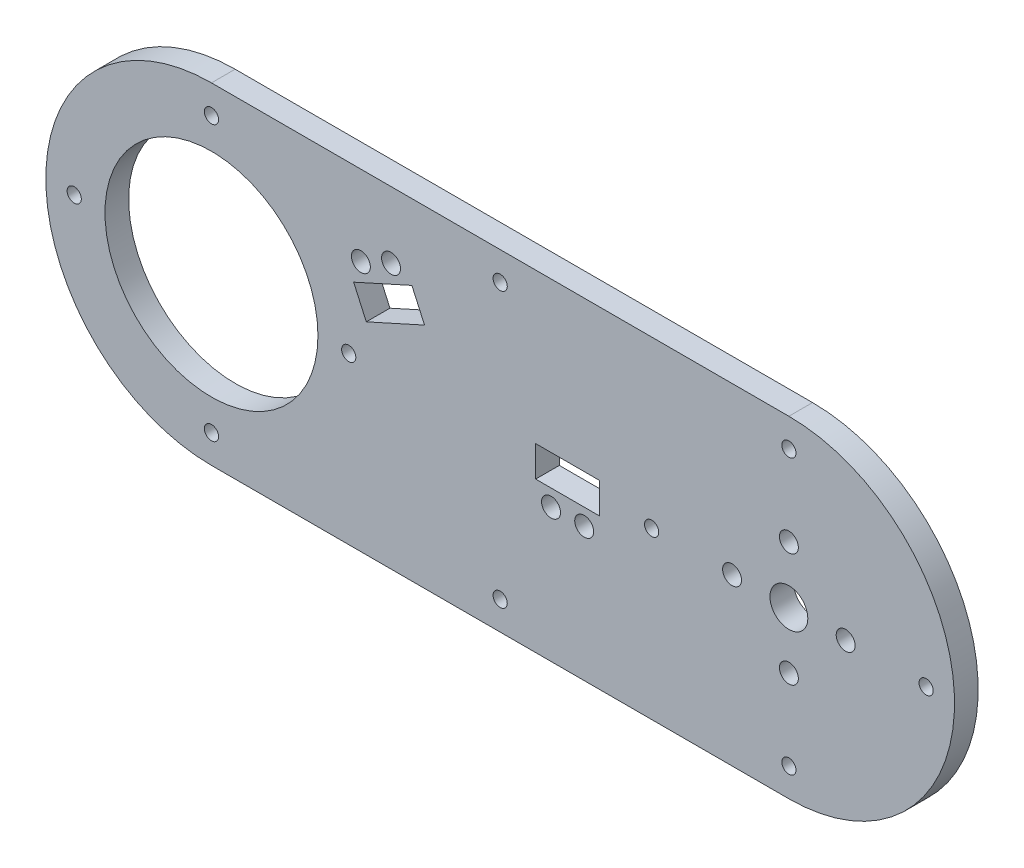
ISO-10303-21;
HEADER;
FILE_DESCRIPTION(('STEP AP214'),'2;1');
FILE_NAME('part.step','',(''),(''),'','','');
FILE_SCHEMA(('AUTOMOTIVE_DESIGN { 1 0 10303 214 1 1 1 1 }'));
ENDSEC;
DATA;
#1=APPLICATION_CONTEXT('core data for automotive mechanical design processes');
#2=APPLICATION_PROTOCOL_DEFINITION('international standard','automotive_design',2000,#1);
#3=PRODUCT_CONTEXT('',#1,'mechanical');
#4=PRODUCT('Part','Part','',(#3));
#5=PRODUCT_RELATED_PRODUCT_CATEGORY('part','',(#4));
#6=PRODUCT_DEFINITION_FORMATION('','',#4);
#7=PRODUCT_DEFINITION_CONTEXT('part definition',#1,'design');
#8=PRODUCT_DEFINITION('design','',#6,#7);
#9=PRODUCT_DEFINITION_SHAPE('','',#8);
#10=(LENGTH_UNIT() NAMED_UNIT(*) SI_UNIT(.MILLI.,.METRE.));
#11=(NAMED_UNIT(*) PLANE_ANGLE_UNIT() SI_UNIT($,.RADIAN.));
#12=(NAMED_UNIT(*) SI_UNIT($,.STERADIAN.) SOLID_ANGLE_UNIT());
#13=UNCERTAINTY_MEASURE_WITH_UNIT(LENGTH_MEASURE(1.E-05),#10,'distance_accuracy_value','');
#14=(GEOMETRIC_REPRESENTATION_CONTEXT(3) GLOBAL_UNCERTAINTY_ASSIGNED_CONTEXT((#13)) GLOBAL_UNIT_ASSIGNED_CONTEXT((#10,
#11,#12)) REPRESENTATION_CONTEXT('',''));
#15=CARTESIAN_POINT('',(0.,0.,0.));
#16=DIRECTION('',(0.,0.,1.));
#17=DIRECTION('',(1.,0.,0.));
#18=AXIS2_PLACEMENT_3D('',#15,#16,#17);
#19=CARTESIAN_POINT('',(61.,0.,5.));
#20=DIRECTION('',(0.,0.,1.));
#21=DIRECTION('',(1.,0.,0.));
#22=AXIS2_PLACEMENT_3D('',#19,#20,#21);
#23=PLANE('',#22);
#24=CARTESIAN_POINT('',(-23.0549050416263,20.964824554477,5.));
#25=DIRECTION('',(0.,0.,1.));
#26=DIRECTION('',(1.,0.,0.));
#27=AXIS2_PLACEMENT_3D('',#24,#25,#26);
#28=CIRCLE('',#27,2.);
#29=CARTESIAN_POINT('',(-21.0549050416263,20.964824554477,5.));
#30=VERTEX_POINT('',#29);
#31=EDGE_CURVE('E151',#30,#30,#28,.T.);
#32=ORIENTED_EDGE('',*,*,#31,.F.);
#33=EDGE_LOOP('',(#32));
#34=FACE_BOUND('',#33,.T.);
#35=CARTESIAN_POINT('',(10.75,-6.74999999999998,5.));
#36=DIRECTION('',(0.,0.,1.));
#37=DIRECTION('',(1.,0.,0.));
#38=AXIS2_PLACEMENT_3D('',#35,#36,#37);
#39=CIRCLE('',#38,2.);
#40=CARTESIAN_POINT('',(12.75,-6.74999999999998,5.));
#41=VERTEX_POINT('',#40);
#42=EDGE_CURVE('E167',#41,#41,#39,.T.);
#43=ORIENTED_EDGE('',*,*,#42,.F.);
#44=EDGE_LOOP('',(#43));
#45=FACE_BOUND('',#44,.T.);
#46=CARTESIAN_POINT('',(49.,0.,5.));
#47=DIRECTION('',(0.,0.,1.));
#48=DIRECTION('',(1.,0.,0.));
#49=AXIS2_PLACEMENT_3D('',#46,#47,#48);
#50=CIRCLE('',#49,2.);
#51=CARTESIAN_POINT('',(51.,0.,5.));
#52=VERTEX_POINT('',#51);
#53=EDGE_CURVE('E179',#52,#52,#50,.T.);
#54=ORIENTED_EDGE('',*,*,#53,.F.);
#55=EDGE_LOOP('',(#54));
#56=FACE_BOUND('',#55,.T.);
#57=CARTESIAN_POINT('',(32.,0.,5.));
#58=DIRECTION('',(0.,0.,1.));
#59=DIRECTION('',(1.,0.,0.));
#60=AXIS2_PLACEMENT_3D('',#57,#58,#59);
#61=CIRCLE('',#60,1.5);
#62=CARTESIAN_POINT('',(33.5,0.,5.));
#63=VERTEX_POINT('',#62);
#64=EDGE_CURVE('E191',#63,#63,#61,.T.);
#65=ORIENTED_EDGE('',*,*,#64,.F.);
#66=EDGE_LOOP('',(#65));
#67=FACE_BOUND('',#66,.T.);
#68=CARTESIAN_POINT('',(90.,0.,5.));
#69=DIRECTION('',(0.,0.,1.));
#70=DIRECTION('',(1.,0.,0.));
#71=AXIS2_PLACEMENT_3D('',#68,#69,#70);
#72=CIRCLE('',#71,1.5);
#73=CARTESIAN_POINT('',(91.5,0.,5.));
#74=VERTEX_POINT('',#73);
#75=EDGE_CURVE('E203',#74,#74,#72,.T.);
#76=ORIENTED_EDGE('',*,*,#75,.F.);
#77=EDGE_LOOP('',(#76));
#78=FACE_BOUND('',#77,.T.);
#79=CARTESIAN_POINT('',(-90.,0.,5.));
#80=DIRECTION('',(0.,0.,1.));
#81=DIRECTION('',(1.,0.,0.));
#82=AXIS2_PLACEMENT_3D('',#79,#80,#81);
#83=CIRCLE('',#82,1.5);
#84=CARTESIAN_POINT('',(-88.5,0.,5.));
#85=VERTEX_POINT('',#84);
#86=EDGE_CURVE('E215',#85,#85,#83,.T.);
#87=ORIENTED_EDGE('',*,*,#86,.F.);
#88=EDGE_LOOP('',(#87));
#89=FACE_BOUND('',#88,.T.);
#90=CARTESIAN_POINT('',(0.,-29.,5.));
#91=DIRECTION('',(0.,0.,1.));
#92=DIRECTION('',(1.,0.,0.));
#93=AXIS2_PLACEMENT_3D('',#90,#91,#92);
#94=CIRCLE('',#93,1.5);
#95=CARTESIAN_POINT('',(1.5,-29.,5.));
#96=VERTEX_POINT('',#95);
#97=EDGE_CURVE('E227',#96,#96,#94,.T.);
#98=ORIENTED_EDGE('',*,*,#97,.F.);
#99=EDGE_LOOP('',(#98));
#100=FACE_BOUND('',#99,.T.);
#101=CARTESIAN_POINT('',(61.,29.,5.));
#102=DIRECTION('',(0.,0.,1.));
#103=DIRECTION('',(1.,0.,0.));
#104=AXIS2_PLACEMENT_3D('',#101,#102,#103);
#105=CIRCLE('',#104,1.5);
#106=CARTESIAN_POINT('',(62.5,29.,5.));
#107=VERTEX_POINT('',#106);
#108=EDGE_CURVE('E270',#107,#107,#105,.T.);
#109=ORIENTED_EDGE('',*,*,#108,.F.);
#110=EDGE_LOOP('',(#109));
#111=FACE_BOUND('',#110,.T.);
#112=CARTESIAN_POINT('',(-61.,-29.,5.));
#113=DIRECTION('',(0.,0.,1.));
#114=DIRECTION('',(1.,0.,0.));
#115=AXIS2_PLACEMENT_3D('',#112,#113,#114);
#116=CIRCLE('',#115,1.5);
#117=CARTESIAN_POINT('',(-59.5,-29.,5.));
#118=VERTEX_POINT('',#117);
#119=EDGE_CURVE('E282',#118,#118,#116,.T.);
#120=ORIENTED_EDGE('',*,*,#119,.F.);
#121=EDGE_LOOP('',(#120));
#122=FACE_BOUND('',#121,.T.);
#123=CARTESIAN_POINT('',(61.,0.,5.));
#124=DIRECTION('',(0.,0.,1.));
#125=DIRECTION('',(1.,0.,0.));
#126=AXIS2_PLACEMENT_3D('',#123,#124,#125);
#127=CIRCLE('',#126,4.);
#128=CARTESIAN_POINT('',(65.,0.,5.));
#129=VERTEX_POINT('',#128);
#130=EDGE_CURVE('E294',#129,#129,#127,.T.);
#131=ORIENTED_EDGE('',*,*,#130,.F.);
#132=EDGE_LOOP('',(#131));
#133=FACE_BOUND('',#132,.T.);
#134=CARTESIAN_POINT('',(61.,0.,5.));
#135=DIRECTION('',(0.,0.,1.));
#136=DIRECTION('',(1.,0.,0.));
#137=AXIS2_PLACEMENT_3D('',#134,#135,#136);
#138=CIRCLE('',#137,35.);
#139=CARTESIAN_POINT('',(61.,-35.,5.));
#140=VERTEX_POINT('',#139);
#141=CARTESIAN_POINT('',(61.,35.,5.));
#142=VERTEX_POINT('',#141);
#143=EDGE_CURVE('E300',#140,#142,#138,.T.);
#144=ORIENTED_EDGE('',*,*,#143,.T.);
#145=DIRECTION('',(-1.,0.,0.));
#146=VECTOR('',#145,1.);
#147=CARTESIAN_POINT('',(61.,35.,5.));
#148=LINE('',#147,#146);
#149=CARTESIAN_POINT('',(-61.,35.,5.));
#150=VERTEX_POINT('',#149);
#151=EDGE_CURVE('E303',#142,#150,#148,.T.);
#152=ORIENTED_EDGE('',*,*,#151,.T.);
#153=CARTESIAN_POINT('',(-61.,0.,5.));
#154=DIRECTION('',(0.,0.,1.));
#155=DIRECTION('',(1.,0.,0.));
#156=AXIS2_PLACEMENT_3D('',#153,#154,#155);
#157=CIRCLE('',#156,35.);
#158=CARTESIAN_POINT('',(-61.,-35.,5.));
#159=VERTEX_POINT('',#158);
#160=EDGE_CURVE('E306',#150,#159,#157,.T.);
#161=ORIENTED_EDGE('',*,*,#160,.T.);
#162=DIRECTION('',(1.,0.,0.));
#163=VECTOR('',#162,1.);
#164=CARTESIAN_POINT('',(61.,-35.,5.));
#165=LINE('',#164,#163);
#166=EDGE_CURVE('E308',#159,#140,#165,.T.);
#167=ORIENTED_EDGE('',*,*,#166,.T.);
#168=EDGE_LOOP('',(#144,#152,#161,#167));
#169=FACE_BOUND('',#168,.T.);
#170=CARTESIAN_POINT('',(-61.,0.,5.));
#171=DIRECTION('',(0.,0.,1.));
#172=DIRECTION('',(1.,0.,0.));
#173=AXIS2_PLACEMENT_3D('',#170,#171,#172);
#174=CIRCLE('',#173,22.5);
#175=CARTESIAN_POINT('',(-38.5,0.,5.));
#176=VERTEX_POINT('',#175);
#177=EDGE_CURVE('E288',#176,#176,#174,.T.);
#178=ORIENTED_EDGE('',*,*,#177,.F.);
#179=EDGE_LOOP('',(#178));
#180=FACE_BOUND('',#179,.T.);
#181=CARTESIAN_POINT('',(-61.,29.,5.));
#182=DIRECTION('',(0.,0.,1.));
#183=DIRECTION('',(1.,0.,0.));
#184=AXIS2_PLACEMENT_3D('',#181,#182,#183);
#185=CIRCLE('',#184,1.5);
#186=CARTESIAN_POINT('',(-59.5,29.,5.));
#187=VERTEX_POINT('',#186);
#188=EDGE_CURVE('E276',#187,#187,#185,.T.);
#189=ORIENTED_EDGE('',*,*,#188,.F.);
#190=EDGE_LOOP('',(#189));
#191=FACE_BOUND('',#190,.T.);
#192=CARTESIAN_POINT('',(61.,-29.,5.));
#193=DIRECTION('',(0.,0.,1.));
#194=DIRECTION('',(1.,0.,0.));
#195=AXIS2_PLACEMENT_3D('',#192,#193,#194);
#196=CIRCLE('',#195,1.5);
#197=CARTESIAN_POINT('',(62.5,-29.,5.));
#198=VERTEX_POINT('',#197);
#199=EDGE_CURVE('E264',#198,#198,#196,.T.);
#200=ORIENTED_EDGE('',*,*,#199,.F.);
#201=EDGE_LOOP('',(#200));
#202=FACE_BOUND('',#201,.T.);
#203=DIRECTION('',(-1.,0.,0.));
#204=VECTOR('',#203,1.);
#205=CARTESIAN_POINT('',(21.,3.25000000000002,5.));
#206=LINE('',#205,#204);
#207=CARTESIAN_POINT('',(21.,3.25000000000002,5.));
#208=VERTEX_POINT('',#207);
#209=CARTESIAN_POINT('',(7.5,3.25,5.));
#210=VERTEX_POINT('',#209);
#211=EDGE_CURVE('E235',#208,#210,#206,.T.);
#212=ORIENTED_EDGE('',*,*,#211,.F.);
#213=DIRECTION('',(0.,1.,0.));
#214=VECTOR('',#213,1.);
#215=CARTESIAN_POINT('',(21.,-3.24999999999998,5.));
#216=LINE('',#215,#214);
#217=CARTESIAN_POINT('',(21.,-3.24999999999998,5.));
#218=VERTEX_POINT('',#217);
#219=EDGE_CURVE('E233',#218,#208,#216,.T.);
#220=ORIENTED_EDGE('',*,*,#219,.F.);
#221=DIRECTION('',(1.,0.,0.));
#222=VECTOR('',#221,1.);
#223=CARTESIAN_POINT('',(7.5,-3.24999999999998,5.));
#224=LINE('',#223,#222);
#225=CARTESIAN_POINT('',(7.50000000000001,-3.24999999999998,5.));
#226=VERTEX_POINT('',#225);
#227=EDGE_CURVE('E241',#226,#218,#224,.T.);
#228=ORIENTED_EDGE('',*,*,#227,.F.);
#229=DIRECTION('',(0.,-1.,0.));
#230=VECTOR('',#229,1.);
#231=CARTESIAN_POINT('',(7.5,3.25,5.));
#232=LINE('',#231,#230);
#233=EDGE_CURVE('E238',#210,#226,#232,.T.);
#234=ORIENTED_EDGE('',*,*,#233,.F.);
#235=EDGE_LOOP('',(#212,#220,#228,#234));
#236=FACE_BOUND('',#235,.T.);
#237=CARTESIAN_POINT('',(0.,29.,5.));
#238=DIRECTION('',(0.,0.,1.));
#239=DIRECTION('',(1.,0.,0.));
#240=AXIS2_PLACEMENT_3D('',#237,#238,#239);
#241=CIRCLE('',#240,1.5);
#242=CARTESIAN_POINT('',(1.5,29.,5.));
#243=VERTEX_POINT('',#242);
#244=EDGE_CURVE('E221',#243,#243,#241,.T.);
#245=ORIENTED_EDGE('',*,*,#244,.F.);
#246=EDGE_LOOP('',(#245));
#247=FACE_BOUND('',#246,.T.);
#248=CARTESIAN_POINT('',(-32.,0.,5.));
#249=DIRECTION('',(0.,0.,1.));
#250=DIRECTION('',(1.,0.,0.));
#251=AXIS2_PLACEMENT_3D('',#248,#249,#250);
#252=CIRCLE('',#251,1.5);
#253=CARTESIAN_POINT('',(-30.5,0.,5.));
#254=VERTEX_POINT('',#253);
#255=EDGE_CURVE('E209',#254,#254,#252,.T.);
#256=ORIENTED_EDGE('',*,*,#255,.F.);
#257=EDGE_LOOP('',(#256));
#258=FACE_BOUND('',#257,.T.);
#259=CARTESIAN_POINT('',(61.,12.,5.));
#260=DIRECTION('',(0.,0.,1.));
#261=DIRECTION('',(1.,0.,0.));
#262=AXIS2_PLACEMENT_3D('',#259,#260,#261);
#263=CIRCLE('',#262,2.);
#264=CARTESIAN_POINT('',(63.,12.,5.));
#265=VERTEX_POINT('',#264);
#266=EDGE_CURVE('E197',#265,#265,#263,.T.);
#267=ORIENTED_EDGE('',*,*,#266,.F.);
#268=EDGE_LOOP('',(#267));
#269=FACE_BOUND('',#268,.T.);
#270=CARTESIAN_POINT('',(61.,-12.,5.));
#271=DIRECTION('',(0.,0.,1.));
#272=DIRECTION('',(1.,0.,0.));
#273=AXIS2_PLACEMENT_3D('',#270,#271,#272);
#274=CIRCLE('',#273,2.);
#275=CARTESIAN_POINT('',(63.,-12.,5.));
#276=VERTEX_POINT('',#275);
#277=EDGE_CURVE('E185',#276,#276,#274,.T.);
#278=ORIENTED_EDGE('',*,*,#277,.F.);
#279=EDGE_LOOP('',(#278));
#280=FACE_BOUND('',#279,.T.);
#281=CARTESIAN_POINT('',(73.,0.,5.));
#282=DIRECTION('',(0.,0.,1.));
#283=DIRECTION('',(1.,0.,0.));
#284=AXIS2_PLACEMENT_3D('',#281,#282,#283);
#285=CIRCLE('',#284,2.);
#286=CARTESIAN_POINT('',(75.,0.,5.));
#287=VERTEX_POINT('',#286);
#288=EDGE_CURVE('E173',#287,#287,#285,.T.);
#289=ORIENTED_EDGE('',*,*,#288,.F.);
#290=EDGE_LOOP('',(#289));
#291=FACE_BOUND('',#290,.T.);
#292=CARTESIAN_POINT('',(17.75,-6.74999999999998,5.));
#293=DIRECTION('',(0.,0.,1.));
#294=DIRECTION('',(1.,0.,0.));
#295=AXIS2_PLACEMENT_3D('',#292,#293,#294);
#296=CIRCLE('',#295,2.);
#297=CARTESIAN_POINT('',(19.75,-6.74999999999998,5.));
#298=VERTEX_POINT('',#297);
#299=EDGE_CURVE('E161',#298,#298,#296,.T.);
#300=ORIENTED_EDGE('',*,*,#299,.F.);
#301=EDGE_LOOP('',(#300));
#302=FACE_BOUND('',#301,.T.);
#303=DIRECTION('',(-0.911475085558383,-0.41135528245829,0.));
#304=VECTOR('',#303,1.);
#305=CARTESIAN_POINT('',(-18.6528675249575,19.1115664230121,5.));
#306=LINE('',#305,#304);
#307=CARTESIAN_POINT('',(-18.6528675249575,19.1115664230121,5.));
#308=VERTEX_POINT('',#307);
#309=CARTESIAN_POINT('',(-30.9577811799957,13.5582701098252,5.));
#310=VERTEX_POINT('',#309);
#311=EDGE_CURVE('E130',#308,#310,#306,.T.);
#312=ORIENTED_EDGE('',*,*,#311,.F.);
#313=DIRECTION('',(-0.411355282458289,0.911475085558383,0.));
#314=VECTOR('',#313,1.);
#315=CARTESIAN_POINT('',(-15.9790581889787,13.1869783668826,5.));
#316=LINE('',#315,#314);
#317=CARTESIAN_POINT('',(-15.9790581889787,13.1869783668826,5.));
#318=VERTEX_POINT('',#317);
#319=EDGE_CURVE('E122',#318,#308,#316,.T.);
#320=ORIENTED_EDGE('',*,*,#319,.F.);
#321=DIRECTION('',(0.911475085558383,0.411355282458289,0.));
#322=VECTOR('',#321,1.);
#323=CARTESIAN_POINT('',(-28.2839718440168,7.63368205369572,5.));
#324=LINE('',#323,#322);
#325=CARTESIAN_POINT('',(-28.2839718440168,7.63368205369572,5.));
#326=VERTEX_POINT('',#325);
#327=EDGE_CURVE('E145',#326,#318,#324,.T.);
#328=ORIENTED_EDGE('',*,*,#327,.F.);
#329=DIRECTION('',(0.411355282458289,-0.911475085558383,0.));
#330=VECTOR('',#329,1.);
#331=CARTESIAN_POINT('',(-30.9577811799957,13.5582701098252,5.));
#332=LINE('',#331,#330);
#333=EDGE_CURVE('E143',#310,#326,#332,.T.);
#334=ORIENTED_EDGE('',*,*,#333,.F.);
#335=EDGE_LOOP('',(#312,#320,#328,#334));
#336=FACE_BOUND('',#335,.T.);
#337=CARTESIAN_POINT('',(-29.435230640535,18.085337577269,5.));
#338=DIRECTION('',(0.,0.,1.));
#339=DIRECTION('',(1.,0.,0.));
#340=AXIS2_PLACEMENT_3D('',#337,#338,#339);
#341=CIRCLE('',#340,2.);
#342=CARTESIAN_POINT('',(-27.435230640535,18.085337577269,5.));
#343=VERTEX_POINT('',#342);
#344=EDGE_CURVE('E399',#343,#343,#341,.T.);
#345=ORIENTED_EDGE('',*,*,#344,.F.);
#346=EDGE_LOOP('',(#345));
#347=FACE_BOUND('',#346,.T.);
#348=ADVANCED_FACE('F33',(#34,#45,#56,#67,#78,#89,#100,#111,#122,#133,#169,#180,#191,#202,#236,
#247,#258,#269,#280,#291,#302,#336,#347),#23,.T.);
#349=CARTESIAN_POINT('',(61.,0.,0.));
#350=DIRECTION('',(0.,0.,1.));
#351=DIRECTION('',(1.,0.,0.));
#352=AXIS2_PLACEMENT_3D('',#349,#350,#351);
#353=PLANE('',#352);
#354=CARTESIAN_POINT('',(17.75,-6.74999999999998,0.));
#355=DIRECTION('',(0.,0.,1.));
#356=DIRECTION('',(1.,0.,0.));
#357=AXIS2_PLACEMENT_3D('',#354,#355,#356);
#358=CIRCLE('',#357,2.);
#359=CARTESIAN_POINT('',(19.75,-6.74999999999998,0.));
#360=VERTEX_POINT('',#359);
#361=EDGE_CURVE('E138',#360,#360,#358,.T.);
#362=ORIENTED_EDGE('',*,*,#361,.T.);
#363=EDGE_LOOP('',(#362));
#364=FACE_BOUND('',#363,.T.);
#365=CARTESIAN_POINT('',(10.75,-6.74999999999998,0.));
#366=DIRECTION('',(0.,0.,1.));
#367=DIRECTION('',(1.,0.,0.));
#368=AXIS2_PLACEMENT_3D('',#365,#366,#367);
#369=CIRCLE('',#368,2.);
#370=CARTESIAN_POINT('',(12.75,-6.74999999999998,0.));
#371=VERTEX_POINT('',#370);
#372=EDGE_CURVE('E164',#371,#371,#369,.T.);
#373=ORIENTED_EDGE('',*,*,#372,.T.);
#374=EDGE_LOOP('',(#373));
#375=FACE_BOUND('',#374,.T.);
#376=CARTESIAN_POINT('',(73.,0.,0.));
#377=DIRECTION('',(0.,0.,1.));
#378=DIRECTION('',(1.,0.,0.));
#379=AXIS2_PLACEMENT_3D('',#376,#377,#378);
#380=CIRCLE('',#379,2.);
#381=CARTESIAN_POINT('',(75.,0.,0.));
#382=VERTEX_POINT('',#381);
#383=EDGE_CURVE('E170',#382,#382,#380,.T.);
#384=ORIENTED_EDGE('',*,*,#383,.T.);
#385=EDGE_LOOP('',(#384));
#386=FACE_BOUND('',#385,.T.);
#387=CARTESIAN_POINT('',(49.,0.,0.));
#388=DIRECTION('',(0.,0.,1.));
#389=DIRECTION('',(1.,0.,0.));
#390=AXIS2_PLACEMENT_3D('',#387,#388,#389);
#391=CIRCLE('',#390,2.);
#392=CARTESIAN_POINT('',(51.,0.,0.));
#393=VERTEX_POINT('',#392);
#394=EDGE_CURVE('E176',#393,#393,#391,.T.);
#395=ORIENTED_EDGE('',*,*,#394,.T.);
#396=EDGE_LOOP('',(#395));
#397=FACE_BOUND('',#396,.T.);
#398=CARTESIAN_POINT('',(61.,-12.,0.));
#399=DIRECTION('',(0.,0.,1.));
#400=DIRECTION('',(1.,0.,0.));
#401=AXIS2_PLACEMENT_3D('',#398,#399,#400);
#402=CIRCLE('',#401,2.);
#403=CARTESIAN_POINT('',(63.,-12.,0.));
#404=VERTEX_POINT('',#403);
#405=EDGE_CURVE('E182',#404,#404,#402,.T.);
#406=ORIENTED_EDGE('',*,*,#405,.T.);
#407=EDGE_LOOP('',(#406));
#408=FACE_BOUND('',#407,.T.);
#409=CARTESIAN_POINT('',(32.,0.,0.));
#410=DIRECTION('',(0.,0.,1.));
#411=DIRECTION('',(1.,0.,0.));
#412=AXIS2_PLACEMENT_3D('',#409,#410,#411);
#413=CIRCLE('',#412,1.5);
#414=CARTESIAN_POINT('',(33.5,0.,0.));
#415=VERTEX_POINT('',#414);
#416=EDGE_CURVE('E188',#415,#415,#413,.T.);
#417=ORIENTED_EDGE('',*,*,#416,.T.);
#418=EDGE_LOOP('',(#417));
#419=FACE_BOUND('',#418,.T.);
#420=CARTESIAN_POINT('',(61.,12.,0.));
#421=DIRECTION('',(0.,0.,1.));
#422=DIRECTION('',(1.,0.,0.));
#423=AXIS2_PLACEMENT_3D('',#420,#421,#422);
#424=CIRCLE('',#423,2.);
#425=CARTESIAN_POINT('',(63.,12.,0.));
#426=VERTEX_POINT('',#425);
#427=EDGE_CURVE('E194',#426,#426,#424,.T.);
#428=ORIENTED_EDGE('',*,*,#427,.T.);
#429=EDGE_LOOP('',(#428));
#430=FACE_BOUND('',#429,.T.);
#431=CARTESIAN_POINT('',(90.,0.,0.));
#432=DIRECTION('',(0.,0.,1.));
#433=DIRECTION('',(1.,0.,0.));
#434=AXIS2_PLACEMENT_3D('',#431,#432,#433);
#435=CIRCLE('',#434,1.5);
#436=CARTESIAN_POINT('',(91.5,0.,0.));
#437=VERTEX_POINT('',#436);
#438=EDGE_CURVE('E200',#437,#437,#435,.T.);
#439=ORIENTED_EDGE('',*,*,#438,.T.);
#440=EDGE_LOOP('',(#439));
#441=FACE_BOUND('',#440,.T.);
#442=CARTESIAN_POINT('',(-32.,0.,0.));
#443=DIRECTION('',(0.,0.,1.));
#444=DIRECTION('',(1.,0.,0.));
#445=AXIS2_PLACEMENT_3D('',#442,#443,#444);
#446=CIRCLE('',#445,1.5);
#447=CARTESIAN_POINT('',(-30.5,0.,0.));
#448=VERTEX_POINT('',#447);
#449=EDGE_CURVE('E206',#448,#448,#446,.T.);
#450=ORIENTED_EDGE('',*,*,#449,.T.);
#451=EDGE_LOOP('',(#450));
#452=FACE_BOUND('',#451,.T.);
#453=CARTESIAN_POINT('',(-90.,0.,0.));
#454=DIRECTION('',(0.,0.,1.));
#455=DIRECTION('',(1.,0.,0.));
#456=AXIS2_PLACEMENT_3D('',#453,#454,#455);
#457=CIRCLE('',#456,1.5);
#458=CARTESIAN_POINT('',(-88.5,0.,0.));
#459=VERTEX_POINT('',#458);
#460=EDGE_CURVE('E212',#459,#459,#457,.T.);
#461=ORIENTED_EDGE('',*,*,#460,.T.);
#462=EDGE_LOOP('',(#461));
#463=FACE_BOUND('',#462,.T.);
#464=CARTESIAN_POINT('',(0.,29.,0.));
#465=DIRECTION('',(0.,0.,1.));
#466=DIRECTION('',(1.,0.,0.));
#467=AXIS2_PLACEMENT_3D('',#464,#465,#466);
#468=CIRCLE('',#467,1.5);
#469=CARTESIAN_POINT('',(1.5,29.,0.));
#470=VERTEX_POINT('',#469);
#471=EDGE_CURVE('E218',#470,#470,#468,.T.);
#472=ORIENTED_EDGE('',*,*,#471,.T.);
#473=EDGE_LOOP('',(#472));
#474=FACE_BOUND('',#473,.T.);
#475=CARTESIAN_POINT('',(0.,-29.,0.));
#476=DIRECTION('',(0.,0.,1.));
#477=DIRECTION('',(1.,0.,0.));
#478=AXIS2_PLACEMENT_3D('',#475,#476,#477);
#479=CIRCLE('',#478,1.5);
#480=CARTESIAN_POINT('',(1.5,-29.,0.));
#481=VERTEX_POINT('',#480);
#482=EDGE_CURVE('E224',#481,#481,#479,.T.);
#483=ORIENTED_EDGE('',*,*,#482,.T.);
#484=EDGE_LOOP('',(#483));
#485=FACE_BOUND('',#484,.T.);
#486=DIRECTION('',(0.,1.,0.));
#487=VECTOR('',#486,1.);
#488=CARTESIAN_POINT('',(21.,-3.24999999999998,0.));
#489=LINE('',#488,#487);
#490=CARTESIAN_POINT('',(21.,-3.24999999999998,0.));
#491=VERTEX_POINT('',#490);
#492=CARTESIAN_POINT('',(21.,3.25000000000002,0.));
#493=VERTEX_POINT('',#492);
#494=EDGE_CURVE('E230',#491,#493,#489,.T.);
#495=ORIENTED_EDGE('',*,*,#494,.T.);
#496=DIRECTION('',(-1.,0.,0.));
#497=VECTOR('',#496,1.);
#498=CARTESIAN_POINT('',(21.,3.25000000000002,0.));
#499=LINE('',#498,#497);
#500=CARTESIAN_POINT('',(7.5,3.25,0.));
#501=VERTEX_POINT('',#500);
#502=EDGE_CURVE('E246',#493,#501,#499,.T.);
#503=ORIENTED_EDGE('',*,*,#502,.T.);
#504=DIRECTION('',(0.,-1.,0.));
#505=VECTOR('',#504,1.);
#506=CARTESIAN_POINT('',(7.5,3.25,0.));
#507=LINE('',#506,#505);
#508=CARTESIAN_POINT('',(7.5,-3.24999999999998,0.));
#509=VERTEX_POINT('',#508);
#510=EDGE_CURVE('E249',#501,#509,#507,.T.);
#511=ORIENTED_EDGE('',*,*,#510,.T.);
#512=DIRECTION('',(1.,0.,0.));
#513=VECTOR('',#512,1.);
#514=CARTESIAN_POINT('',(7.5,-3.24999999999998,0.));
#515=LINE('',#514,#513);
#516=EDGE_CURVE('E236',#509,#491,#515,.T.);
#517=ORIENTED_EDGE('',*,*,#516,.T.);
#518=EDGE_LOOP('',(#495,#503,#511,#517));
#519=FACE_BOUND('',#518,.T.);
#520=CARTESIAN_POINT('',(61.,0.,0.));
#521=DIRECTION('',(0.,0.,1.));
#522=DIRECTION('',(1.,0.,0.));
#523=AXIS2_PLACEMENT_3D('',#520,#521,#522);
#524=CIRCLE('',#523,35.);
#525=CARTESIAN_POINT('',(61.,-35.,0.));
#526=VERTEX_POINT('',#525);
#527=CARTESIAN_POINT('',(61.,35.,0.));
#528=VERTEX_POINT('',#527);
#529=EDGE_CURVE('E297',#526,#528,#524,.T.);
#530=ORIENTED_EDGE('',*,*,#529,.F.);
#531=DIRECTION('',(1.,0.,0.));
#532=VECTOR('',#531,1.);
#533=CARTESIAN_POINT('',(61.,-35.,0.));
#534=LINE('',#533,#532);
#535=CARTESIAN_POINT('',(-61.,-35.,0.));
#536=VERTEX_POINT('',#535);
#537=EDGE_CURVE('E304',#536,#526,#534,.T.);
#538=ORIENTED_EDGE('',*,*,#537,.F.);
#539=CARTESIAN_POINT('',(-61.,0.,0.));
#540=DIRECTION('',(0.,0.,1.));
#541=DIRECTION('',(1.,0.,0.));
#542=AXIS2_PLACEMENT_3D('',#539,#540,#541);
#543=CIRCLE('',#542,35.);
#544=CARTESIAN_POINT('',(-61.,35.,0.));
#545=VERTEX_POINT('',#544);
#546=EDGE_CURVE('E315',#545,#536,#543,.T.);
#547=ORIENTED_EDGE('',*,*,#546,.F.);
#548=DIRECTION('',(-1.,0.,0.));
#549=VECTOR('',#548,1.);
#550=CARTESIAN_POINT('',(61.,35.,0.));
#551=LINE('',#550,#549);
#552=EDGE_CURVE('E313',#528,#545,#551,.T.);
#553=ORIENTED_EDGE('',*,*,#552,.F.);
#554=EDGE_LOOP('',(#530,#538,#547,#553));
#555=FACE_BOUND('',#554,.T.);
#556=CARTESIAN_POINT('',(61.,0.,0.));
#557=DIRECTION('',(0.,0.,1.));
#558=DIRECTION('',(1.,0.,0.));
#559=AXIS2_PLACEMENT_3D('',#556,#557,#558);
#560=CIRCLE('',#559,4.);
#561=CARTESIAN_POINT('',(65.,0.,0.));
#562=VERTEX_POINT('',#561);
#563=EDGE_CURVE('E291',#562,#562,#560,.T.);
#564=ORIENTED_EDGE('',*,*,#563,.T.);
#565=EDGE_LOOP('',(#564));
#566=FACE_BOUND('',#565,.T.);
#567=CARTESIAN_POINT('',(-61.,0.,0.));
#568=DIRECTION('',(0.,0.,1.));
#569=DIRECTION('',(1.,0.,0.));
#570=AXIS2_PLACEMENT_3D('',#567,#568,#569);
#571=CIRCLE('',#570,22.5);
#572=CARTESIAN_POINT('',(-38.5,0.,0.));
#573=VERTEX_POINT('',#572);
#574=EDGE_CURVE('E285',#573,#573,#571,.T.);
#575=ORIENTED_EDGE('',*,*,#574,.T.);
#576=EDGE_LOOP('',(#575));
#577=FACE_BOUND('',#576,.T.);
#578=CARTESIAN_POINT('',(-61.,-29.,0.));
#579=DIRECTION('',(0.,0.,1.));
#580=DIRECTION('',(1.,0.,0.));
#581=AXIS2_PLACEMENT_3D('',#578,#579,#580);
#582=CIRCLE('',#581,1.5);
#583=CARTESIAN_POINT('',(-59.5,-29.,0.));
#584=VERTEX_POINT('',#583);
#585=EDGE_CURVE('E279',#584,#584,#582,.T.);
#586=ORIENTED_EDGE('',*,*,#585,.T.);
#587=EDGE_LOOP('',(#586));
#588=FACE_BOUND('',#587,.T.);
#589=CARTESIAN_POINT('',(-61.,29.,0.));
#590=DIRECTION('',(0.,0.,1.));
#591=DIRECTION('',(1.,0.,0.));
#592=AXIS2_PLACEMENT_3D('',#589,#590,#591);
#593=CIRCLE('',#592,1.5);
#594=CARTESIAN_POINT('',(-59.5,29.,0.));
#595=VERTEX_POINT('',#594);
#596=EDGE_CURVE('E273',#595,#595,#593,.T.);
#597=ORIENTED_EDGE('',*,*,#596,.T.);
#598=EDGE_LOOP('',(#597));
#599=FACE_BOUND('',#598,.T.);
#600=CARTESIAN_POINT('',(61.,29.,0.));
#601=DIRECTION('',(0.,0.,1.));
#602=DIRECTION('',(1.,0.,0.));
#603=AXIS2_PLACEMENT_3D('',#600,#601,#602);
#604=CIRCLE('',#603,1.5);
#605=CARTESIAN_POINT('',(62.5,29.,0.));
#606=VERTEX_POINT('',#605);
#607=EDGE_CURVE('E267',#606,#606,#604,.T.);
#608=ORIENTED_EDGE('',*,*,#607,.T.);
#609=EDGE_LOOP('',(#608));
#610=FACE_BOUND('',#609,.T.);
#611=CARTESIAN_POINT('',(61.,-29.,0.));
#612=DIRECTION('',(0.,0.,1.));
#613=DIRECTION('',(1.,0.,0.));
#614=AXIS2_PLACEMENT_3D('',#611,#612,#613);
#615=CIRCLE('',#614,1.5);
#616=CARTESIAN_POINT('',(62.5,-29.,0.));
#617=VERTEX_POINT('',#616);
#618=EDGE_CURVE('E263',#617,#617,#615,.T.);
#619=ORIENTED_EDGE('',*,*,#618,.T.);
#620=EDGE_LOOP('',(#619));
#621=FACE_BOUND('',#620,.T.);
#622=DIRECTION('',(-0.411355282458289,0.911475085558383,0.));
#623=VECTOR('',#622,1.);
#624=CARTESIAN_POINT('',(-15.9790581889787,13.1869783668826,0.));
#625=LINE('',#624,#623);
#626=CARTESIAN_POINT('',(-15.9790581889787,13.1869783668826,0.));
#627=VERTEX_POINT('',#626);
#628=CARTESIAN_POINT('',(-18.6528675249575,19.1115664230121,0.));
#629=VERTEX_POINT('',#628);
#630=EDGE_CURVE('E56',#627,#629,#625,.T.);
#631=ORIENTED_EDGE('',*,*,#630,.T.);
#632=DIRECTION('',(-0.911475085558383,-0.41135528245829,0.));
#633=VECTOR('',#632,1.);
#634=CARTESIAN_POINT('',(-18.6528675249575,19.1115664230121,0.));
#635=LINE('',#634,#633);
#636=CARTESIAN_POINT('',(-30.9577811799957,13.5582701098252,0.));
#637=VERTEX_POINT('',#636);
#638=EDGE_CURVE('E137',#629,#637,#635,.T.);
#639=ORIENTED_EDGE('',*,*,#638,.T.);
#640=DIRECTION('',(0.411355282458289,-0.911475085558383,0.));
#641=VECTOR('',#640,1.);
#642=CARTESIAN_POINT('',(-30.9577811799957,13.5582701098252,0.));
#643=LINE('',#642,#641);
#644=CARTESIAN_POINT('',(-28.2839718440168,7.63368205369572,0.));
#645=VERTEX_POINT('',#644);
#646=EDGE_CURVE('E153',#637,#645,#643,.T.);
#647=ORIENTED_EDGE('',*,*,#646,.T.);
#648=DIRECTION('',(0.911475085558383,0.411355282458289,0.));
#649=VECTOR('',#648,1.);
#650=CARTESIAN_POINT('',(-28.2839718440168,7.63368205369572,0.));
#651=LINE('',#650,#649);
#652=EDGE_CURVE('E131',#645,#627,#651,.T.);
#653=ORIENTED_EDGE('',*,*,#652,.T.);
#654=EDGE_LOOP('',(#631,#639,#647,#653));
#655=FACE_BOUND('',#654,.T.);
#656=CARTESIAN_POINT('',(-23.0549050416263,20.964824554477,0.));
#657=DIRECTION('',(0.,0.,1.));
#658=DIRECTION('',(1.,0.,0.));
#659=AXIS2_PLACEMENT_3D('',#656,#657,#658);
#660=CIRCLE('',#659,2.);
#661=CARTESIAN_POINT('',(-21.0549050416263,20.964824554477,0.));
#662=VERTEX_POINT('',#661);
#663=EDGE_CURVE('E394',#662,#662,#660,.T.);
#664=ORIENTED_EDGE('',*,*,#663,.T.);
#665=EDGE_LOOP('',(#664));
#666=FACE_BOUND('',#665,.T.);
#667=CARTESIAN_POINT('',(-29.435230640535,18.085337577269,0.));
#668=DIRECTION('',(0.,0.,1.));
#669=DIRECTION('',(1.,0.,0.));
#670=AXIS2_PLACEMENT_3D('',#667,#668,#669);
#671=CIRCLE('',#670,2.);
#672=CARTESIAN_POINT('',(-27.435230640535,18.085337577269,0.));
#673=VERTEX_POINT('',#672);
#674=EDGE_CURVE('E397',#673,#673,#671,.T.);
#675=ORIENTED_EDGE('',*,*,#674,.T.);
#676=EDGE_LOOP('',(#675));
#677=FACE_BOUND('',#676,.T.);
#678=ADVANCED_FACE('F333',(#364,#375,#386,#397,#408,#419,#430,#441,#452,#463,#474,#485,#519,
#555,#566,#577,#588,#599,#610,#621,#655,#666,#677),#353,.F.);
#679=CARTESIAN_POINT('',(61.,0.,5.));
#680=DIRECTION('',(0.,0.,-1.));
#681=DIRECTION('',(-1.,0.,0.));
#682=AXIS2_PLACEMENT_3D('',#679,#680,#681);
#683=CYLINDRICAL_SURFACE('',#682,35.);
#684=ORIENTED_EDGE('',*,*,#529,.T.);
#685=DIRECTION('',(0.,0.,-1.));
#686=VECTOR('',#685,1.);
#687=CARTESIAN_POINT('',(61.,35.,5.));
#688=LINE('',#687,#686);
#689=EDGE_CURVE('E11',#142,#528,#688,.T.);
#690=ORIENTED_EDGE('',*,*,#689,.F.);
#691=ORIENTED_EDGE('',*,*,#143,.F.);
#692=DIRECTION('',(0.,0.,-1.));
#693=VECTOR('',#692,1.);
#694=CARTESIAN_POINT('',(61.,-35.,5.));
#695=LINE('',#694,#693);
#696=EDGE_CURVE('E310',#140,#526,#695,.T.);
#697=ORIENTED_EDGE('',*,*,#696,.T.);
#698=EDGE_LOOP('',(#684,#690,#691,#697));
#699=FACE_BOUND('',#698,.T.);
#700=ADVANCED_FACE('F35',(#699),#683,.T.);
#701=CARTESIAN_POINT('',(61.,35.,5.));
#702=DIRECTION('',(0.,-1.,0.));
#703=DIRECTION('',(1.,0.,0.));
#704=AXIS2_PLACEMENT_3D('',#701,#702,#703);
#705=PLANE('',#704);
#706=ORIENTED_EDGE('',*,*,#552,.T.);
#707=DIRECTION('',(0.,0.,-1.));
#708=VECTOR('',#707,1.);
#709=CARTESIAN_POINT('',(-61.,35.,5.));
#710=LINE('',#709,#708);
#711=EDGE_CURVE('E41',#150,#545,#710,.T.);
#712=ORIENTED_EDGE('',*,*,#711,.F.);
#713=ORIENTED_EDGE('',*,*,#151,.F.);
#714=ORIENTED_EDGE('',*,*,#689,.T.);
#715=EDGE_LOOP('',(#706,#712,#713,#714));
#716=FACE_BOUND('',#715,.T.);
#717=ADVANCED_FACE('F344',(#716),#705,.F.);
#718=CARTESIAN_POINT('',(-61.,0.,5.));
#719=DIRECTION('',(0.,0.,-1.));
#720=DIRECTION('',(-1.,0.,0.));
#721=AXIS2_PLACEMENT_3D('',#718,#719,#720);
#722=CYLINDRICAL_SURFACE('',#721,35.);
#723=ORIENTED_EDGE('',*,*,#546,.T.);
#724=DIRECTION('',(0.,0.,-1.));
#725=VECTOR('',#724,1.);
#726=CARTESIAN_POINT('',(-61.,-35.,5.));
#727=LINE('',#726,#725);
#728=EDGE_CURVE('E320',#159,#536,#727,.T.);
#729=ORIENTED_EDGE('',*,*,#728,.F.);
#730=ORIENTED_EDGE('',*,*,#160,.F.);
#731=ORIENTED_EDGE('',*,*,#711,.T.);
#732=EDGE_LOOP('',(#723,#729,#730,#731));
#733=FACE_BOUND('',#732,.T.);
#734=ADVANCED_FACE('F327',(#733),#722,.T.);
#735=CARTESIAN_POINT('',(61.,-35.,5.));
#736=DIRECTION('',(0.,1.,0.));
#737=DIRECTION('',(-1.,0.,0.));
#738=AXIS2_PLACEMENT_3D('',#735,#736,#737);
#739=PLANE('',#738);
#740=ORIENTED_EDGE('',*,*,#537,.T.);
#741=ORIENTED_EDGE('',*,*,#696,.F.);
#742=ORIENTED_EDGE('',*,*,#166,.F.);
#743=ORIENTED_EDGE('',*,*,#728,.T.);
#744=EDGE_LOOP('',(#740,#741,#742,#743));
#745=FACE_BOUND('',#744,.T.);
#746=ADVANCED_FACE('F337',(#745),#739,.F.);
#747=CARTESIAN_POINT('',(61.,0.,5.));
#748=DIRECTION('',(0.,0.,-1.));
#749=DIRECTION('',(-1.,0.,0.));
#750=AXIS2_PLACEMENT_3D('',#747,#748,#749);
#751=CYLINDRICAL_SURFACE('',#750,4.);
#752=ORIENTED_EDGE('',*,*,#130,.T.);
#753=EDGE_LOOP('',(#752));
#754=FACE_BOUND('',#753,.T.);
#755=ORIENTED_EDGE('',*,*,#563,.F.);
#756=EDGE_LOOP('',(#755));
#757=FACE_BOUND('',#756,.T.);
#758=ADVANCED_FACE('F362',(#754,#757),#751,.F.);
#759=CARTESIAN_POINT('',(-61.,0.,5.));
#760=DIRECTION('',(0.,0.,-1.));
#761=DIRECTION('',(-1.,0.,0.));
#762=AXIS2_PLACEMENT_3D('',#759,#760,#761);
#763=CYLINDRICAL_SURFACE('',#762,22.5);
#764=ORIENTED_EDGE('',*,*,#177,.T.);
#765=EDGE_LOOP('',(#764));
#766=FACE_BOUND('',#765,.T.);
#767=ORIENTED_EDGE('',*,*,#574,.F.);
#768=EDGE_LOOP('',(#767));
#769=FACE_BOUND('',#768,.T.);
#770=ADVANCED_FACE('F369',(#766,#769),#763,.F.);
#771=CARTESIAN_POINT('',(-61.,-29.,5.));
#772=DIRECTION('',(0.,0.,-1.));
#773=DIRECTION('',(-1.,0.,0.));
#774=AXIS2_PLACEMENT_3D('',#771,#772,#773);
#775=CYLINDRICAL_SURFACE('',#774,1.5);
#776=ORIENTED_EDGE('',*,*,#119,.T.);
#777=EDGE_LOOP('',(#776));
#778=FACE_BOUND('',#777,.T.);
#779=ORIENTED_EDGE('',*,*,#585,.F.);
#780=EDGE_LOOP('',(#779));
#781=FACE_BOUND('',#780,.T.);
#782=ADVANCED_FACE('F374',(#778,#781),#775,.F.);
#783=CARTESIAN_POINT('',(-61.,29.,5.));
#784=DIRECTION('',(0.,0.,-1.));
#785=DIRECTION('',(-1.,0.,0.));
#786=AXIS2_PLACEMENT_3D('',#783,#784,#785);
#787=CYLINDRICAL_SURFACE('',#786,1.5);
#788=ORIENTED_EDGE('',*,*,#188,.T.);
#789=EDGE_LOOP('',(#788));
#790=FACE_BOUND('',#789,.T.);
#791=ORIENTED_EDGE('',*,*,#596,.F.);
#792=EDGE_LOOP('',(#791));
#793=FACE_BOUND('',#792,.T.);
#794=ADVANCED_FACE('F499',(#790,#793),#787,.F.);
#795=CARTESIAN_POINT('',(61.,29.,5.));
#796=DIRECTION('',(0.,0.,-1.));
#797=DIRECTION('',(-1.,0.,0.));
#798=AXIS2_PLACEMENT_3D('',#795,#796,#797);
#799=CYLINDRICAL_SURFACE('',#798,1.5);
#800=ORIENTED_EDGE('',*,*,#108,.T.);
#801=EDGE_LOOP('',(#800));
#802=FACE_BOUND('',#801,.T.);
#803=ORIENTED_EDGE('',*,*,#607,.F.);
#804=EDGE_LOOP('',(#803));
#805=FACE_BOUND('',#804,.T.);
#806=ADVANCED_FACE('F495',(#802,#805),#799,.F.);
#807=CARTESIAN_POINT('',(61.,-29.,5.));
#808=DIRECTION('',(0.,0.,-1.));
#809=DIRECTION('',(-1.,0.,0.));
#810=AXIS2_PLACEMENT_3D('',#807,#808,#809);
#811=CYLINDRICAL_SURFACE('',#810,1.5);
#812=ORIENTED_EDGE('',*,*,#199,.T.);
#813=EDGE_LOOP('',(#812));
#814=FACE_BOUND('',#813,.T.);
#815=ORIENTED_EDGE('',*,*,#618,.F.);
#816=EDGE_LOOP('',(#815));
#817=FACE_BOUND('',#816,.T.);
#818=ADVANCED_FACE('F491',(#814,#817),#811,.F.);
#819=CARTESIAN_POINT('',(21.,-3.24999999999998,5.));
#820=DIRECTION('',(-1.,0.,0.));
#821=DIRECTION('',(0.,-1.,0.));
#822=AXIS2_PLACEMENT_3D('',#819,#820,#821);
#823=PLANE('',#822);
#824=ORIENTED_EDGE('',*,*,#494,.F.);
#825=DIRECTION('',(0.,0.,-1.));
#826=VECTOR('',#825,1.);
#827=CARTESIAN_POINT('',(21.,-3.24999999999998,5.));
#828=LINE('',#827,#826);
#829=EDGE_CURVE('E243',#218,#491,#828,.T.);
#830=ORIENTED_EDGE('',*,*,#829,.F.);
#831=ORIENTED_EDGE('',*,*,#219,.T.);
#832=DIRECTION('',(0.,0.,-1.));
#833=VECTOR('',#832,1.);
#834=CARTESIAN_POINT('',(21.,3.25000000000002,5.));
#835=LINE('',#834,#833);
#836=EDGE_CURVE('E260',#208,#493,#835,.T.);
#837=ORIENTED_EDGE('',*,*,#836,.T.);
#838=EDGE_LOOP('',(#824,#830,#831,#837));
#839=FACE_BOUND('',#838,.T.);
#840=ADVANCED_FACE('F487',(#839),#823,.T.);
#841=CARTESIAN_POINT('',(21.,3.25000000000002,5.));
#842=DIRECTION('',(0.,-1.,0.));
#843=DIRECTION('',(1.,0.,0.));
#844=AXIS2_PLACEMENT_3D('',#841,#842,#843);
#845=PLANE('',#844);
#846=ORIENTED_EDGE('',*,*,#502,.F.);
#847=ORIENTED_EDGE('',*,*,#836,.F.);
#848=ORIENTED_EDGE('',*,*,#211,.T.);
#849=DIRECTION('',(0.,0.,-1.));
#850=VECTOR('',#849,1.);
#851=CARTESIAN_POINT('',(7.5,3.25,5.));
#852=LINE('',#851,#850);
#853=EDGE_CURVE('E258',#210,#501,#852,.T.);
#854=ORIENTED_EDGE('',*,*,#853,.T.);
#855=EDGE_LOOP('',(#846,#847,#848,#854));
#856=FACE_BOUND('',#855,.T.);
#857=ADVANCED_FACE('F483',(#856),#845,.T.);
#858=CARTESIAN_POINT('',(7.5,3.25,5.));
#859=DIRECTION('',(1.,0.,0.));
#860=DIRECTION('',(0.,1.,0.));
#861=AXIS2_PLACEMENT_3D('',#858,#859,#860);
#862=PLANE('',#861);
#863=ORIENTED_EDGE('',*,*,#510,.F.);
#864=ORIENTED_EDGE('',*,*,#853,.F.);
#865=ORIENTED_EDGE('',*,*,#233,.T.);
#866=DIRECTION('',(0.,0.,-1.));
#867=VECTOR('',#866,1.);
#868=CARTESIAN_POINT('',(7.5,-3.24999999999998,5.));
#869=LINE('',#868,#867);
#870=EDGE_CURVE('E256',#226,#509,#869,.T.);
#871=ORIENTED_EDGE('',*,*,#870,.T.);
#872=EDGE_LOOP('',(#863,#864,#865,#871));
#873=FACE_BOUND('',#872,.T.);
#874=ADVANCED_FACE('F479',(#873),#862,.T.);
#875=CARTESIAN_POINT('',(7.5,-3.24999999999998,5.));
#876=DIRECTION('',(0.,1.,0.));
#877=DIRECTION('',(-1.,0.,0.));
#878=AXIS2_PLACEMENT_3D('',#875,#876,#877);
#879=PLANE('',#878);
#880=ORIENTED_EDGE('',*,*,#516,.F.);
#881=ORIENTED_EDGE('',*,*,#870,.F.);
#882=ORIENTED_EDGE('',*,*,#227,.T.);
#883=ORIENTED_EDGE('',*,*,#829,.T.);
#884=EDGE_LOOP('',(#880,#881,#882,#883));
#885=FACE_BOUND('',#884,.T.);
#886=ADVANCED_FACE('F475',(#885),#879,.T.);
#887=CARTESIAN_POINT('',(0.,-29.,5.));
#888=DIRECTION('',(0.,0.,-1.));
#889=DIRECTION('',(-1.,0.,0.));
#890=AXIS2_PLACEMENT_3D('',#887,#888,#889);
#891=CYLINDRICAL_SURFACE('',#890,1.5);
#892=ORIENTED_EDGE('',*,*,#97,.T.);
#893=EDGE_LOOP('',(#892));
#894=FACE_BOUND('',#893,.T.);
#895=ORIENTED_EDGE('',*,*,#482,.F.);
#896=EDGE_LOOP('',(#895));
#897=FACE_BOUND('',#896,.T.);
#898=ADVANCED_FACE('F471',(#894,#897),#891,.F.);
#899=CARTESIAN_POINT('',(0.,29.,5.));
#900=DIRECTION('',(0.,0.,-1.));
#901=DIRECTION('',(-1.,0.,0.));
#902=AXIS2_PLACEMENT_3D('',#899,#900,#901);
#903=CYLINDRICAL_SURFACE('',#902,1.5);
#904=ORIENTED_EDGE('',*,*,#244,.T.);
#905=EDGE_LOOP('',(#904));
#906=FACE_BOUND('',#905,.T.);
#907=ORIENTED_EDGE('',*,*,#471,.F.);
#908=EDGE_LOOP('',(#907));
#909=FACE_BOUND('',#908,.T.);
#910=ADVANCED_FACE('F467',(#906,#909),#903,.F.);
#911=CARTESIAN_POINT('',(-90.,0.,5.));
#912=DIRECTION('',(0.,0.,-1.));
#913=DIRECTION('',(-1.,0.,0.));
#914=AXIS2_PLACEMENT_3D('',#911,#912,#913);
#915=CYLINDRICAL_SURFACE('',#914,1.5);
#916=ORIENTED_EDGE('',*,*,#86,.T.);
#917=EDGE_LOOP('',(#916));
#918=FACE_BOUND('',#917,.T.);
#919=ORIENTED_EDGE('',*,*,#460,.F.);
#920=EDGE_LOOP('',(#919));
#921=FACE_BOUND('',#920,.T.);
#922=ADVANCED_FACE('F463',(#918,#921),#915,.F.);
#923=CARTESIAN_POINT('',(-32.,0.,5.));
#924=DIRECTION('',(0.,0.,-1.));
#925=DIRECTION('',(-1.,0.,0.));
#926=AXIS2_PLACEMENT_3D('',#923,#924,#925);
#927=CYLINDRICAL_SURFACE('',#926,1.5);
#928=ORIENTED_EDGE('',*,*,#255,.T.);
#929=EDGE_LOOP('',(#928));
#930=FACE_BOUND('',#929,.T.);
#931=ORIENTED_EDGE('',*,*,#449,.F.);
#932=EDGE_LOOP('',(#931));
#933=FACE_BOUND('',#932,.T.);
#934=ADVANCED_FACE('F459',(#930,#933),#927,.F.);
#935=CARTESIAN_POINT('',(90.,0.,5.));
#936=DIRECTION('',(0.,0.,-1.));
#937=DIRECTION('',(-1.,0.,0.));
#938=AXIS2_PLACEMENT_3D('',#935,#936,#937);
#939=CYLINDRICAL_SURFACE('',#938,1.5);
#940=ORIENTED_EDGE('',*,*,#75,.T.);
#941=EDGE_LOOP('',(#940));
#942=FACE_BOUND('',#941,.T.);
#943=ORIENTED_EDGE('',*,*,#438,.F.);
#944=EDGE_LOOP('',(#943));
#945=FACE_BOUND('',#944,.T.);
#946=ADVANCED_FACE('F455',(#942,#945),#939,.F.);
#947=CARTESIAN_POINT('',(61.,12.,5.));
#948=DIRECTION('',(0.,0.,-1.));
#949=DIRECTION('',(-1.,0.,0.));
#950=AXIS2_PLACEMENT_3D('',#947,#948,#949);
#951=CYLINDRICAL_SURFACE('',#950,2.);
#952=ORIENTED_EDGE('',*,*,#266,.T.);
#953=EDGE_LOOP('',(#952));
#954=FACE_BOUND('',#953,.T.);
#955=ORIENTED_EDGE('',*,*,#427,.F.);
#956=EDGE_LOOP('',(#955));
#957=FACE_BOUND('',#956,.T.);
#958=ADVANCED_FACE('F451',(#954,#957),#951,.F.);
#959=CARTESIAN_POINT('',(32.,0.,5.));
#960=DIRECTION('',(0.,0.,-1.));
#961=DIRECTION('',(-1.,0.,0.));
#962=AXIS2_PLACEMENT_3D('',#959,#960,#961);
#963=CYLINDRICAL_SURFACE('',#962,1.5);
#964=ORIENTED_EDGE('',*,*,#64,.T.);
#965=EDGE_LOOP('',(#964));
#966=FACE_BOUND('',#965,.T.);
#967=ORIENTED_EDGE('',*,*,#416,.F.);
#968=EDGE_LOOP('',(#967));
#969=FACE_BOUND('',#968,.T.);
#970=ADVANCED_FACE('F447',(#966,#969),#963,.F.);
#971=CARTESIAN_POINT('',(61.,-12.,5.));
#972=DIRECTION('',(0.,0.,-1.));
#973=DIRECTION('',(-1.,0.,0.));
#974=AXIS2_PLACEMENT_3D('',#971,#972,#973);
#975=CYLINDRICAL_SURFACE('',#974,2.);
#976=ORIENTED_EDGE('',*,*,#277,.T.);
#977=EDGE_LOOP('',(#976));
#978=FACE_BOUND('',#977,.T.);
#979=ORIENTED_EDGE('',*,*,#405,.F.);
#980=EDGE_LOOP('',(#979));
#981=FACE_BOUND('',#980,.T.);
#982=ADVANCED_FACE('F443',(#978,#981),#975,.F.);
#983=CARTESIAN_POINT('',(49.,0.,5.));
#984=DIRECTION('',(0.,0.,-1.));
#985=DIRECTION('',(-1.,0.,0.));
#986=AXIS2_PLACEMENT_3D('',#983,#984,#985);
#987=CYLINDRICAL_SURFACE('',#986,2.);
#988=ORIENTED_EDGE('',*,*,#53,.T.);
#989=EDGE_LOOP('',(#988));
#990=FACE_BOUND('',#989,.T.);
#991=ORIENTED_EDGE('',*,*,#394,.F.);
#992=EDGE_LOOP('',(#991));
#993=FACE_BOUND('',#992,.T.);
#994=ADVANCED_FACE('F439',(#990,#993),#987,.F.);
#995=CARTESIAN_POINT('',(73.,0.,5.));
#996=DIRECTION('',(0.,0.,-1.));
#997=DIRECTION('',(-1.,0.,0.));
#998=AXIS2_PLACEMENT_3D('',#995,#996,#997);
#999=CYLINDRICAL_SURFACE('',#998,2.);
#1000=ORIENTED_EDGE('',*,*,#288,.T.);
#1001=EDGE_LOOP('',(#1000));
#1002=FACE_BOUND('',#1001,.T.);
#1003=ORIENTED_EDGE('',*,*,#383,.F.);
#1004=EDGE_LOOP('',(#1003));
#1005=FACE_BOUND('',#1004,.T.);
#1006=ADVANCED_FACE('F435',(#1002,#1005),#999,.F.);
#1007=CARTESIAN_POINT('',(10.75,-6.74999999999998,5.));
#1008=DIRECTION('',(0.,0.,-1.));
#1009=DIRECTION('',(-1.,0.,0.));
#1010=AXIS2_PLACEMENT_3D('',#1007,#1008,#1009);
#1011=CYLINDRICAL_SURFACE('',#1010,2.);
#1012=ORIENTED_EDGE('',*,*,#42,.T.);
#1013=EDGE_LOOP('',(#1012));
#1014=FACE_BOUND('',#1013,.T.);
#1015=ORIENTED_EDGE('',*,*,#372,.F.);
#1016=EDGE_LOOP('',(#1015));
#1017=FACE_BOUND('',#1016,.T.);
#1018=ADVANCED_FACE('F431',(#1014,#1017),#1011,.F.);
#1019=CARTESIAN_POINT('',(17.75,-6.74999999999998,5.));
#1020=DIRECTION('',(0.,0.,-1.));
#1021=DIRECTION('',(-1.,0.,0.));
#1022=AXIS2_PLACEMENT_3D('',#1019,#1020,#1021);
#1023=CYLINDRICAL_SURFACE('',#1022,2.);
#1024=ORIENTED_EDGE('',*,*,#299,.T.);
#1025=EDGE_LOOP('',(#1024));
#1026=FACE_BOUND('',#1025,.T.);
#1027=ORIENTED_EDGE('',*,*,#361,.F.);
#1028=EDGE_LOOP('',(#1027));
#1029=FACE_BOUND('',#1028,.T.);
#1030=ADVANCED_FACE('F428',(#1026,#1029),#1023,.F.);
#1031=CARTESIAN_POINT('',(-15.9790581889787,13.1869783668826,5.));
#1032=DIRECTION('',(-0.911475085558383,-0.411355282458289,0.));
#1033=DIRECTION('',(0.411355282458289,-0.911475085558383,0.));
#1034=AXIS2_PLACEMENT_3D('',#1031,#1032,#1033);
#1035=PLANE('',#1034);
#1036=ORIENTED_EDGE('',*,*,#630,.F.);
#1037=DIRECTION('',(0.,0.,-1.));
#1038=VECTOR('',#1037,1.);
#1039=CARTESIAN_POINT('',(-15.9790581889787,13.1869783668826,5.));
#1040=LINE('',#1039,#1038);
#1041=EDGE_CURVE('E126',#318,#627,#1040,.T.);
#1042=ORIENTED_EDGE('',*,*,#1041,.F.);
#1043=ORIENTED_EDGE('',*,*,#319,.T.);
#1044=DIRECTION('',(0.,0.,-1.));
#1045=VECTOR('',#1044,1.);
#1046=CARTESIAN_POINT('',(-18.6528675249575,19.1115664230121,5.));
#1047=LINE('',#1046,#1045);
#1048=EDGE_CURVE('E125',#308,#629,#1047,.T.);
#1049=ORIENTED_EDGE('',*,*,#1048,.T.);
#1050=EDGE_LOOP('',(#1036,#1042,#1043,#1049));
#1051=FACE_BOUND('',#1050,.T.);
#1052=ADVANCED_FACE('F124',(#1051),#1035,.T.);
#1053=CARTESIAN_POINT('',(-18.6528675249575,19.1115664230121,5.));
#1054=DIRECTION('',(0.41135528245829,-0.911475085558383,0.));
#1055=DIRECTION('',(0.911475085558383,0.41135528245829,0.));
#1056=AXIS2_PLACEMENT_3D('',#1053,#1054,#1055);
#1057=PLANE('',#1056);
#1058=ORIENTED_EDGE('',*,*,#638,.F.);
#1059=ORIENTED_EDGE('',*,*,#1048,.F.);
#1060=ORIENTED_EDGE('',*,*,#311,.T.);
#1061=DIRECTION('',(0.,0.,-1.));
#1062=VECTOR('',#1061,1.);
#1063=CARTESIAN_POINT('',(-30.9577811799957,13.5582701098252,5.));
#1064=LINE('',#1063,#1062);
#1065=EDGE_CURVE('E139',#310,#637,#1064,.T.);
#1066=ORIENTED_EDGE('',*,*,#1065,.T.);
#1067=EDGE_LOOP('',(#1058,#1059,#1060,#1066));
#1068=FACE_BOUND('',#1067,.T.);
#1069=ADVANCED_FACE('F134',(#1068),#1057,.T.);
#1070=CARTESIAN_POINT('',(-30.9577811799957,13.5582701098252,5.));
#1071=DIRECTION('',(0.911475085558383,0.411355282458289,0.));
#1072=DIRECTION('',(-0.411355282458289,0.911475085558383,0.));
#1073=AXIS2_PLACEMENT_3D('',#1070,#1071,#1072);
#1074=PLANE('',#1073);
#1075=ORIENTED_EDGE('',*,*,#646,.F.);
#1076=ORIENTED_EDGE('',*,*,#1065,.F.);
#1077=ORIENTED_EDGE('',*,*,#333,.T.);
#1078=DIRECTION('',(0.,0.,-1.));
#1079=VECTOR('',#1078,1.);
#1080=CARTESIAN_POINT('',(-28.2839718440168,7.63368205369572,5.));
#1081=LINE('',#1080,#1079);
#1082=EDGE_CURVE('E48',#326,#645,#1081,.T.);
#1083=ORIENTED_EDGE('',*,*,#1082,.T.);
#1084=EDGE_LOOP('',(#1075,#1076,#1077,#1083));
#1085=FACE_BOUND('',#1084,.T.);
#1086=ADVANCED_FACE('F418',(#1085),#1074,.T.);
#1087=CARTESIAN_POINT('',(-28.2839718440168,7.63368205369572,5.));
#1088=DIRECTION('',(-0.411355282458289,0.911475085558383,0.));
#1089=DIRECTION('',(-0.911475085558383,-0.411355282458289,0.));
#1090=AXIS2_PLACEMENT_3D('',#1087,#1088,#1089);
#1091=PLANE('',#1090);
#1092=ORIENTED_EDGE('',*,*,#652,.F.);
#1093=ORIENTED_EDGE('',*,*,#1082,.F.);
#1094=ORIENTED_EDGE('',*,*,#327,.T.);
#1095=ORIENTED_EDGE('',*,*,#1041,.T.);
#1096=EDGE_LOOP('',(#1092,#1093,#1094,#1095));
#1097=FACE_BOUND('',#1096,.T.);
#1098=ADVANCED_FACE('F410',(#1097),#1091,.T.);
#1099=CARTESIAN_POINT('',(-23.0549050416263,20.964824554477,5.));
#1100=DIRECTION('',(0.,0.,-1.));
#1101=DIRECTION('',(-1.,0.,0.));
#1102=AXIS2_PLACEMENT_3D('',#1099,#1100,#1101);
#1103=CYLINDRICAL_SURFACE('',#1102,2.);
#1104=ORIENTED_EDGE('',*,*,#31,.T.);
#1105=EDGE_LOOP('',(#1104));
#1106=FACE_BOUND('',#1105,.T.);
#1107=ORIENTED_EDGE('',*,*,#663,.F.);
#1108=EDGE_LOOP('',(#1107));
#1109=FACE_BOUND('',#1108,.T.);
#1110=ADVANCED_FACE('F406',(#1106,#1109),#1103,.F.);
#1111=CARTESIAN_POINT('',(-29.435230640535,18.085337577269,5.));
#1112=DIRECTION('',(0.,0.,-1.));
#1113=DIRECTION('',(-1.,0.,0.));
#1114=AXIS2_PLACEMENT_3D('',#1111,#1112,#1113);
#1115=CYLINDRICAL_SURFACE('',#1114,2.);
#1116=ORIENTED_EDGE('',*,*,#344,.T.);
#1117=EDGE_LOOP('',(#1116));
#1118=FACE_BOUND('',#1117,.T.);
#1119=ORIENTED_EDGE('',*,*,#674,.F.);
#1120=EDGE_LOOP('',(#1119));
#1121=FACE_BOUND('',#1120,.T.);
#1122=ADVANCED_FACE('F409',(#1118,#1121),#1115,.F.);
#1123=CLOSED_SHELL('',(#348,#678,#700,#717,#734,#746,#758,#770,#782,#794,#806,#818,#840,#857,
#874,#886,#898,#910,#922,#934,#946,#958,#970,#982,#994,#1006,#1018,#1030,#1052,#1069,#1086,
#1098,#1110,#1122));
#1124=MANIFOLD_SOLID_BREP('B2',#1123);
#1125=ADVANCED_BREP_SHAPE_REPRESENTATION('',(#18,#1124),#14);
#1126=SHAPE_DEFINITION_REPRESENTATION(#9,#1125);
ENDSEC;
END-ISO-10303-21;
